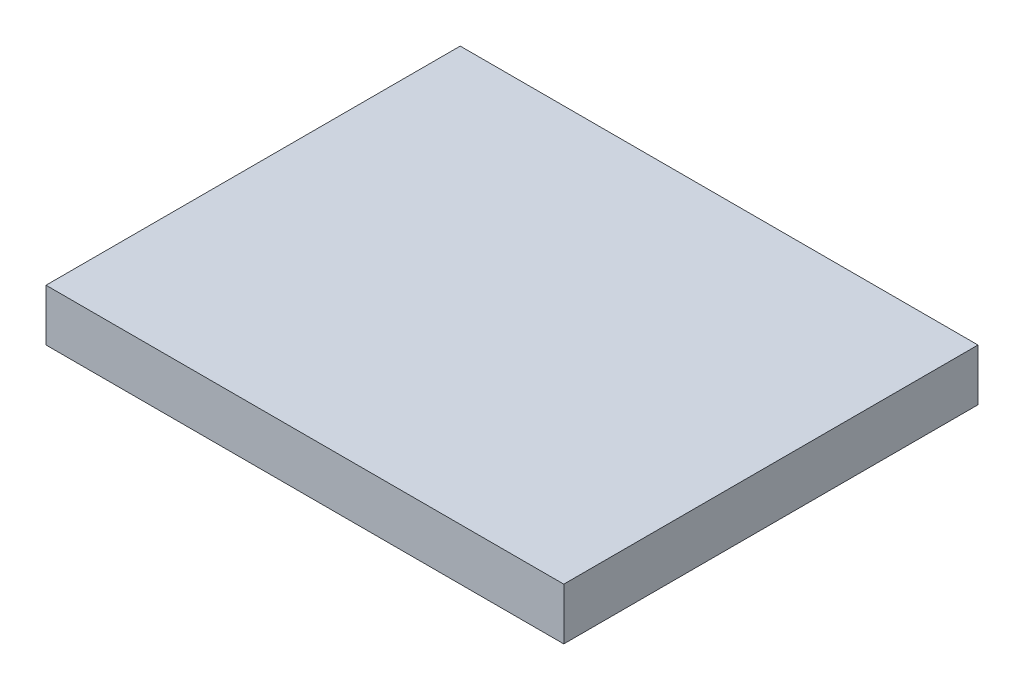
ISO-10303-21;
HEADER;
FILE_DESCRIPTION(('STEP AP214'),'2;1');
FILE_NAME('part.step','',(''),(''),'','','');
FILE_SCHEMA(('AUTOMOTIVE_DESIGN { 1 0 10303 214 1 1 1 1 }'));
ENDSEC;
DATA;
#1=APPLICATION_CONTEXT('core data for automotive mechanical design processes');
#2=APPLICATION_PROTOCOL_DEFINITION('international standard','automotive_design',2000,#1);
#3=PRODUCT_CONTEXT('',#1,'mechanical');
#4=PRODUCT('Part','Part','',(#3));
#5=PRODUCT_RELATED_PRODUCT_CATEGORY('part','',(#4));
#6=PRODUCT_DEFINITION_FORMATION('','',#4);
#7=PRODUCT_DEFINITION_CONTEXT('part definition',#1,'design');
#8=PRODUCT_DEFINITION('design','',#6,#7);
#9=PRODUCT_DEFINITION_SHAPE('','',#8);
#10=(LENGTH_UNIT() NAMED_UNIT(*) SI_UNIT(.MILLI.,.METRE.));
#11=(NAMED_UNIT(*) PLANE_ANGLE_UNIT() SI_UNIT($,.RADIAN.));
#12=(NAMED_UNIT(*) SI_UNIT($,.STERADIAN.) SOLID_ANGLE_UNIT());
#13=UNCERTAINTY_MEASURE_WITH_UNIT(LENGTH_MEASURE(1.E-05),#10,'distance_accuracy_value','');
#14=(GEOMETRIC_REPRESENTATION_CONTEXT(3) GLOBAL_UNCERTAINTY_ASSIGNED_CONTEXT((#13)) GLOBAL_UNIT_ASSIGNED_CONTEXT((#10,
#11,#12)) REPRESENTATION_CONTEXT('',''));
#15=CARTESIAN_POINT('',(0.,0.,0.));
#16=DIRECTION('',(0.,0.,1.));
#17=DIRECTION('',(1.,0.,0.));
#18=AXIS2_PLACEMENT_3D('',#15,#16,#17);
#19=CARTESIAN_POINT('',(25.,2.5,-20.));
#20=DIRECTION('',(-1.,0.,0.));
#21=DIRECTION('',(0.,0.,1.));
#22=AXIS2_PLACEMENT_3D('',#19,#20,#21);
#23=PLANE('',#22);
#24=DIRECTION('',(0.,0.,-1.));
#25=VECTOR('',#24,1.);
#26=CARTESIAN_POINT('',(25.,-2.5,-20.));
#27=LINE('',#26,#25);
#28=CARTESIAN_POINT('',(25.,-2.5,20.));
#29=VERTEX_POINT('',#28);
#30=CARTESIAN_POINT('',(25.,-2.5,-20.));
#31=VERTEX_POINT('',#30);
#32=EDGE_CURVE('E107',#29,#31,#27,.T.);
#33=ORIENTED_EDGE('',*,*,#32,.T.);
#34=DIRECTION('',(0.,-1.,0.));
#35=VECTOR('',#34,1.);
#36=CARTESIAN_POINT('',(25.,2.5,-20.));
#37=LINE('',#36,#35);
#38=CARTESIAN_POINT('',(25.,2.5,-20.));
#39=VERTEX_POINT('',#38);
#40=EDGE_CURVE('E11',#39,#31,#37,.T.);
#41=ORIENTED_EDGE('',*,*,#40,.F.);
#42=DIRECTION('',(0.,0.,-1.));
#43=VECTOR('',#42,1.);
#44=CARTESIAN_POINT('',(25.,2.5,-20.));
#45=LINE('',#44,#43);
#46=CARTESIAN_POINT('',(25.,2.5,20.));
#47=VERTEX_POINT('',#46);
#48=EDGE_CURVE('E91',#47,#39,#45,.T.);
#49=ORIENTED_EDGE('',*,*,#48,.F.);
#50=DIRECTION('',(0.,-1.,0.));
#51=VECTOR('',#50,1.);
#52=CARTESIAN_POINT('',(25.,2.5,20.));
#53=LINE('',#52,#51);
#54=EDGE_CURVE('E103',#47,#29,#53,.T.);
#55=ORIENTED_EDGE('',*,*,#54,.T.);
#56=EDGE_LOOP('',(#33,#41,#49,#55));
#57=FACE_BOUND('',#56,.T.);
#58=ADVANCED_FACE('F39',(#57),#23,.F.);
#59=CARTESIAN_POINT('',(-25.,2.5,-20.));
#60=DIRECTION('',(0.,0.,1.));
#61=DIRECTION('',(1.,0.,0.));
#62=AXIS2_PLACEMENT_3D('',#59,#60,#61);
#63=PLANE('',#62);
#64=DIRECTION('',(-1.,0.,0.));
#65=VECTOR('',#64,1.);
#66=CARTESIAN_POINT('',(-25.,-2.5,-20.));
#67=LINE('',#66,#65);
#68=CARTESIAN_POINT('',(-25.,-2.5,-20.));
#69=VERTEX_POINT('',#68);
#70=EDGE_CURVE('E96',#31,#69,#67,.T.);
#71=ORIENTED_EDGE('',*,*,#70,.T.);
#72=DIRECTION('',(0.,-1.,0.));
#73=VECTOR('',#72,1.);
#74=CARTESIAN_POINT('',(-25.,2.5,-20.));
#75=LINE('',#74,#73);
#76=CARTESIAN_POINT('',(-25.,2.5,-20.));
#77=VERTEX_POINT('',#76);
#78=EDGE_CURVE('E48',#77,#69,#75,.T.);
#79=ORIENTED_EDGE('',*,*,#78,.F.);
#80=DIRECTION('',(-1.,0.,0.));
#81=VECTOR('',#80,1.);
#82=CARTESIAN_POINT('',(-25.,2.5,-20.));
#83=LINE('',#82,#81);
#84=EDGE_CURVE('E86',#39,#77,#83,.T.);
#85=ORIENTED_EDGE('',*,*,#84,.F.);
#86=ORIENTED_EDGE('',*,*,#40,.T.);
#87=EDGE_LOOP('',(#71,#79,#85,#86));
#88=FACE_BOUND('',#87,.T.);
#89=ADVANCED_FACE('F95',(#88),#63,.F.);
#90=CARTESIAN_POINT('',(-25.,2.5,-20.));
#91=DIRECTION('',(1.,0.,0.));
#92=DIRECTION('',(0.,0.,-1.));
#93=AXIS2_PLACEMENT_3D('',#90,#91,#92);
#94=PLANE('',#93);
#95=DIRECTION('',(0.,0.,1.));
#96=VECTOR('',#95,1.);
#97=CARTESIAN_POINT('',(-25.,-2.5,-20.));
#98=LINE('',#97,#96);
#99=CARTESIAN_POINT('',(-25.,-2.5,20.));
#100=VERTEX_POINT('',#99);
#101=EDGE_CURVE('E73',#69,#100,#98,.T.);
#102=ORIENTED_EDGE('',*,*,#101,.T.);
#103=DIRECTION('',(0.,-1.,0.));
#104=VECTOR('',#103,1.);
#105=CARTESIAN_POINT('',(-25.,2.5,20.));
#106=LINE('',#105,#104);
#107=CARTESIAN_POINT('',(-25.,2.5,20.));
#108=VERTEX_POINT('',#107);
#109=EDGE_CURVE('E98',#108,#100,#106,.T.);
#110=ORIENTED_EDGE('',*,*,#109,.F.);
#111=DIRECTION('',(0.,0.,1.));
#112=VECTOR('',#111,1.);
#113=CARTESIAN_POINT('',(-25.,2.5,-20.));
#114=LINE('',#113,#112);
#115=EDGE_CURVE('E89',#77,#108,#114,.T.);
#116=ORIENTED_EDGE('',*,*,#115,.F.);
#117=ORIENTED_EDGE('',*,*,#78,.T.);
#118=EDGE_LOOP('',(#102,#110,#116,#117));
#119=FACE_BOUND('',#118,.T.);
#120=ADVANCED_FACE('F99',(#119),#94,.F.);
#121=CARTESIAN_POINT('',(-25.,2.5,20.));
#122=DIRECTION('',(0.,0.,-1.));
#123=DIRECTION('',(-1.,0.,0.));
#124=AXIS2_PLACEMENT_3D('',#121,#122,#123);
#125=PLANE('',#124);
#126=DIRECTION('',(1.,0.,0.));
#127=VECTOR('',#126,1.);
#128=CARTESIAN_POINT('',(-25.,-2.5,20.));
#129=LINE('',#128,#127);
#130=EDGE_CURVE('E79',#100,#29,#129,.T.);
#131=ORIENTED_EDGE('',*,*,#130,.T.);
#132=ORIENTED_EDGE('',*,*,#54,.F.);
#133=DIRECTION('',(1.,0.,0.));
#134=VECTOR('',#133,1.);
#135=CARTESIAN_POINT('',(-25.,2.5,20.));
#136=LINE('',#135,#134);
#137=EDGE_CURVE('E56',#108,#47,#136,.T.);
#138=ORIENTED_EDGE('',*,*,#137,.F.);
#139=ORIENTED_EDGE('',*,*,#109,.T.);
#140=EDGE_LOOP('',(#131,#132,#138,#139));
#141=FACE_BOUND('',#140,.T.);
#142=ADVANCED_FACE('F120',(#141),#125,.F.);
#143=CARTESIAN_POINT('',(0.,2.5,0.));
#144=DIRECTION('',(0.,1.,0.));
#145=DIRECTION('',(0.,0.,1.));
#146=AXIS2_PLACEMENT_3D('',#143,#144,#145);
#147=PLANE('',#146);
#148=ORIENTED_EDGE('',*,*,#48,.T.);
#149=ORIENTED_EDGE('',*,*,#84,.T.);
#150=ORIENTED_EDGE('',*,*,#115,.T.);
#151=ORIENTED_EDGE('',*,*,#137,.T.);
#152=EDGE_LOOP('',(#148,#149,#150,#151));
#153=FACE_BOUND('',#152,.T.);
#154=ADVANCED_FACE('F87',(#153),#147,.T.);
#155=CARTESIAN_POINT('',(0.,-2.5,0.));
#156=DIRECTION('',(0.,1.,0.));
#157=DIRECTION('',(0.,0.,1.));
#158=AXIS2_PLACEMENT_3D('',#155,#156,#157);
#159=PLANE('',#158);
#160=ORIENTED_EDGE('',*,*,#32,.F.);
#161=ORIENTED_EDGE('',*,*,#130,.F.);
#162=ORIENTED_EDGE('',*,*,#101,.F.);
#163=ORIENTED_EDGE('',*,*,#70,.F.);
#164=EDGE_LOOP('',(#160,#161,#162,#163));
#165=FACE_BOUND('',#164,.T.);
#166=ADVANCED_FACE('F123',(#165),#159,.F.);
#167=CLOSED_SHELL('',(#58,#89,#120,#142,#154,#166));
#168=MANIFOLD_SOLID_BREP('B2',#167);
#169=ADVANCED_BREP_SHAPE_REPRESENTATION('',(#18,#168),#14);
#170=SHAPE_DEFINITION_REPRESENTATION(#9,#169);
ENDSEC;
END-ISO-10303-21;
